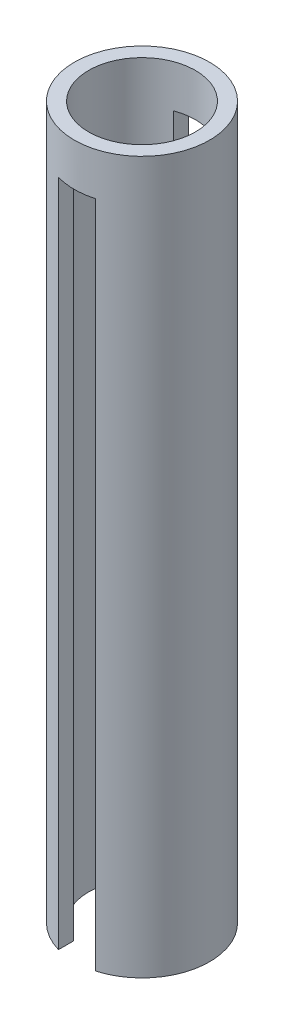
ISO-10303-21;
HEADER;
FILE_DESCRIPTION(('STEP AP214'),'2;1');
FILE_NAME('part.step','',(''),(''),'','','');
FILE_SCHEMA(('AUTOMOTIVE_DESIGN { 1 0 10303 214 1 1 1 1 }'));
ENDSEC;
DATA;
#1=APPLICATION_CONTEXT('core data for automotive mechanical design processes');
#2=APPLICATION_PROTOCOL_DEFINITION('international standard','automotive_design',2000,#1);
#3=PRODUCT_CONTEXT('',#1,'mechanical');
#4=PRODUCT('Part','Part','',(#3));
#5=PRODUCT_RELATED_PRODUCT_CATEGORY('part','',(#4));
#6=PRODUCT_DEFINITION_FORMATION('','',#4);
#7=PRODUCT_DEFINITION_CONTEXT('part definition',#1,'design');
#8=PRODUCT_DEFINITION('design','',#6,#7);
#9=PRODUCT_DEFINITION_SHAPE('','',#8);
#10=(LENGTH_UNIT() NAMED_UNIT(*) SI_UNIT(.MILLI.,.METRE.));
#11=(NAMED_UNIT(*) PLANE_ANGLE_UNIT() SI_UNIT($,.RADIAN.));
#12=(NAMED_UNIT(*) SI_UNIT($,.STERADIAN.) SOLID_ANGLE_UNIT());
#13=UNCERTAINTY_MEASURE_WITH_UNIT(LENGTH_MEASURE(1.E-05),#10,'distance_accuracy_value','');
#14=(GEOMETRIC_REPRESENTATION_CONTEXT(3) GLOBAL_UNCERTAINTY_ASSIGNED_CONTEXT((#13)) GLOBAL_UNIT_ASSIGNED_CONTEXT((#10,
#11,#12)) REPRESENTATION_CONTEXT('',''));
#15=CARTESIAN_POINT('',(0.,0.,0.));
#16=DIRECTION('',(0.,0.,1.));
#17=DIRECTION('',(1.,0.,0.));
#18=AXIS2_PLACEMENT_3D('',#15,#16,#17);
#19=CARTESIAN_POINT('',(0.,0.,0.));
#20=DIRECTION('',(0.,1.,0.));
#21=DIRECTION('',(0.,0.,1.));
#22=AXIS2_PLACEMENT_3D('',#19,#20,#21);
#23=PLANE('',#22);
#24=CARTESIAN_POINT('',(0.,0.,0.));
#25=DIRECTION('',(0.,1.,0.));
#26=DIRECTION('',(0.,0.,1.));
#27=AXIS2_PLACEMENT_3D('',#24,#25,#26);
#28=CIRCLE('',#27,9.5);
#29=CARTESIAN_POINT('',(-2.6,0.,-9.13728624920988));
#30=VERTEX_POINT('',#29);
#31=CARTESIAN_POINT('',(-2.6,0.,9.13728624920988));
#32=VERTEX_POINT('',#31);
#33=EDGE_CURVE('E122',#30,#32,#28,.T.);
#34=ORIENTED_EDGE('',*,*,#33,.F.);
#35=DIRECTION('',(0.,0.,1.));
#36=VECTOR('',#35,1.);
#37=CARTESIAN_POINT('',(-2.6,0.,-80.));
#38=LINE('',#37,#36);
#39=CARTESIAN_POINT('',(-2.6,0.,-7.03491293478463));
#40=VERTEX_POINT('',#39);
#41=EDGE_CURVE('E106',#30,#40,#38,.T.);
#42=ORIENTED_EDGE('',*,*,#41,.T.);
#43=CARTESIAN_POINT('',(0.,0.,0.));
#44=DIRECTION('',(0.,1.,0.));
#45=DIRECTION('',(0.,0.,1.));
#46=AXIS2_PLACEMENT_3D('',#43,#44,#45);
#47=CIRCLE('',#46,7.5);
#48=CARTESIAN_POINT('',(-2.6,0.,7.03491293478463));
#49=VERTEX_POINT('',#48);
#50=EDGE_CURVE('E147',#40,#49,#47,.T.);
#51=ORIENTED_EDGE('',*,*,#50,.T.);
#52=EDGE_CURVE('E165',#49,#32,#38,.T.);
#53=ORIENTED_EDGE('',*,*,#52,.T.);
#54=EDGE_LOOP('',(#34,#42,#51,#53));
#55=FACE_BOUND('',#54,.T.);
#56=ADVANCED_FACE('F35',(#55),#23,.F.);
#57=CARTESIAN_POINT('',(0.,100.,0.));
#58=DIRECTION('',(0.,1.,0.));
#59=DIRECTION('',(0.,0.,1.));
#60=AXIS2_PLACEMENT_3D('',#57,#58,#59);
#61=PLANE('',#60);
#62=CARTESIAN_POINT('',(0.,100.,0.));
#63=DIRECTION('',(0.,1.,0.));
#64=DIRECTION('',(0.,0.,1.));
#65=AXIS2_PLACEMENT_3D('',#62,#63,#64);
#66=CIRCLE('',#65,9.5);
#67=CARTESIAN_POINT('',(0.,100.,9.5));
#68=VERTEX_POINT('',#67);
#69=EDGE_CURVE('E121',#68,#68,#66,.T.);
#70=ORIENTED_EDGE('',*,*,#69,.T.);
#71=EDGE_LOOP('',(#70));
#72=FACE_BOUND('',#71,.T.);
#73=CARTESIAN_POINT('',(0.,100.,0.));
#74=DIRECTION('',(0.,1.,0.));
#75=DIRECTION('',(0.,0.,1.));
#76=AXIS2_PLACEMENT_3D('',#73,#74,#75);
#77=CIRCLE('',#76,7.5);
#78=CARTESIAN_POINT('',(0.,100.,7.5));
#79=VERTEX_POINT('',#78);
#80=EDGE_CURVE('E127',#79,#79,#77,.T.);
#81=ORIENTED_EDGE('',*,*,#80,.F.);
#82=EDGE_LOOP('',(#81));
#83=FACE_BOUND('',#82,.T.);
#84=ADVANCED_FACE('F190',(#72,#83),#61,.T.);
#85=CARTESIAN_POINT('',(2.6,0.,9.13728624920988));
#86=VERTEX_POINT('',#85);
#87=CARTESIAN_POINT('',(2.6,0.,-9.13728624920988));
#88=VERTEX_POINT('',#87);
#89=EDGE_CURVE('E113',#86,#88,#28,.T.);
#90=ORIENTED_EDGE('',*,*,#89,.F.);
#91=DIRECTION('',(0.,0.,1.));
#92=VECTOR('',#91,1.);
#93=CARTESIAN_POINT('',(2.6,0.,-80.));
#94=LINE('',#93,#92);
#95=CARTESIAN_POINT('',(2.6,0.,7.03491293478463));
#96=VERTEX_POINT('',#95);
#97=EDGE_CURVE('E116',#96,#86,#94,.T.);
#98=ORIENTED_EDGE('',*,*,#97,.F.);
#99=CARTESIAN_POINT('',(2.6,0.,-7.03491293478462));
#100=VERTEX_POINT('',#99);
#101=EDGE_CURVE('E115',#96,#100,#47,.T.);
#102=ORIENTED_EDGE('',*,*,#101,.T.);
#103=EDGE_CURVE('E58',#88,#100,#94,.T.);
#104=ORIENTED_EDGE('',*,*,#103,.F.);
#105=EDGE_LOOP('',(#90,#98,#102,#104));
#106=FACE_BOUND('',#105,.T.);
#107=ADVANCED_FACE('F111',(#106),#23,.F.);
#108=CARTESIAN_POINT('',(0.,100.,0.));
#109=DIRECTION('',(0.,-1.,0.));
#110=DIRECTION('',(0.,0.,-1.));
#111=AXIS2_PLACEMENT_3D('',#108,#109,#110);
#112=CYLINDRICAL_SURFACE('',#111,9.5);
#113=ORIENTED_EDGE('',*,*,#69,.F.);
#114=EDGE_LOOP('',(#113));
#115=FACE_BOUND('',#114,.T.);
#116=ORIENTED_EDGE('',*,*,#33,.T.);
#117=DIRECTION('',(0.,-1.,0.));
#118=VECTOR('',#117,1.);
#119=CARTESIAN_POINT('',(-2.6,100.,9.13728624920988));
#120=LINE('',#119,#118);
#121=CARTESIAN_POINT('',(-2.6,94.,9.13728624920988));
#122=VERTEX_POINT('',#121);
#123=EDGE_CURVE('E155',#32,#122,#120,.F.);
#124=ORIENTED_EDGE('',*,*,#123,.T.);
#125=CARTESIAN_POINT('',(0.,94.,0.));
#126=DIRECTION('',(0.,1.,0.));
#127=DIRECTION('',(0.,0.,1.));
#128=AXIS2_PLACEMENT_3D('',#125,#126,#127);
#129=CIRCLE('',#128,9.5);
#130=CARTESIAN_POINT('',(2.6,94.,9.13728624920988));
#131=VERTEX_POINT('',#130);
#132=EDGE_CURVE('E159',#122,#131,#129,.T.);
#133=ORIENTED_EDGE('',*,*,#132,.T.);
#134=DIRECTION('',(0.,-1.,0.));
#135=VECTOR('',#134,1.);
#136=CARTESIAN_POINT('',(2.6,100.,9.13728624920988));
#137=LINE('',#136,#135);
#138=EDGE_CURVE('E105',#131,#86,#137,.T.);
#139=ORIENTED_EDGE('',*,*,#138,.T.);
#140=ORIENTED_EDGE('',*,*,#89,.T.);
#141=DIRECTION('',(0.,-1.,0.));
#142=VECTOR('',#141,1.);
#143=CARTESIAN_POINT('',(2.6,100.,-9.13728624920988));
#144=LINE('',#143,#142);
#145=CARTESIAN_POINT('',(2.6,94.,-9.13728624920988));
#146=VERTEX_POINT('',#145);
#147=EDGE_CURVE('E98',#88,#146,#144,.F.);
#148=ORIENTED_EDGE('',*,*,#147,.T.);
#149=CARTESIAN_POINT('',(-2.6,94.,-9.13728624920988));
#150=VERTEX_POINT('',#149);
#151=EDGE_CURVE('E158',#146,#150,#129,.T.);
#152=ORIENTED_EDGE('',*,*,#151,.T.);
#153=DIRECTION('',(0.,-1.,0.));
#154=VECTOR('',#153,1.);
#155=CARTESIAN_POINT('',(-2.6,100.,-9.13728624920988));
#156=LINE('',#155,#154);
#157=EDGE_CURVE('E151',#150,#30,#156,.T.);
#158=ORIENTED_EDGE('',*,*,#157,.T.);
#159=EDGE_LOOP('',(#116,#124,#133,#139,#140,#148,#152,#158));
#160=FACE_BOUND('',#159,.T.);
#161=ADVANCED_FACE('F37',(#115,#160),#112,.T.);
#162=CARTESIAN_POINT('',(0.,100.,0.));
#163=DIRECTION('',(0.,-1.,0.));
#164=DIRECTION('',(0.,0.,-1.));
#165=AXIS2_PLACEMENT_3D('',#162,#163,#164);
#166=CYLINDRICAL_SURFACE('',#165,7.5);
#167=DIRECTION('',(0.,-1.,0.));
#168=VECTOR('',#167,1.);
#169=CARTESIAN_POINT('',(-2.6,100.,7.03491293478462));
#170=LINE('',#169,#168);
#171=CARTESIAN_POINT('',(-2.6,94.,7.03491293478462));
#172=VERTEX_POINT('',#171);
#173=EDGE_CURVE('E11',#49,#172,#170,.F.);
#174=ORIENTED_EDGE('',*,*,#173,.F.);
#175=ORIENTED_EDGE('',*,*,#50,.F.);
#176=DIRECTION('',(0.,-1.,0.));
#177=VECTOR('',#176,1.);
#178=CARTESIAN_POINT('',(-2.6,100.,-7.03491293478462));
#179=LINE('',#178,#177);
#180=CARTESIAN_POINT('',(-2.6,94.,-7.03491293478462));
#181=VERTEX_POINT('',#180);
#182=EDGE_CURVE('E133',#181,#40,#179,.T.);
#183=ORIENTED_EDGE('',*,*,#182,.F.);
#184=CARTESIAN_POINT('',(0.,94.,0.));
#185=DIRECTION('',(0.,1.,0.));
#186=DIRECTION('',(0.,0.,1.));
#187=AXIS2_PLACEMENT_3D('',#184,#185,#186);
#188=CIRCLE('',#187,7.5);
#189=CARTESIAN_POINT('',(2.6,94.,-7.03491293478463));
#190=VERTEX_POINT('',#189);
#191=EDGE_CURVE('E131',#190,#181,#188,.T.);
#192=ORIENTED_EDGE('',*,*,#191,.F.);
#193=DIRECTION('',(0.,-1.,0.));
#194=VECTOR('',#193,1.);
#195=CARTESIAN_POINT('',(2.6,100.,-7.03491293478462));
#196=LINE('',#195,#194);
#197=EDGE_CURVE('E125',#100,#190,#196,.F.);
#198=ORIENTED_EDGE('',*,*,#197,.F.);
#199=ORIENTED_EDGE('',*,*,#101,.F.);
#200=DIRECTION('',(0.,-1.,0.));
#201=VECTOR('',#200,1.);
#202=CARTESIAN_POINT('',(2.6,100.,7.03491293478462));
#203=LINE('',#202,#201);
#204=CARTESIAN_POINT('',(2.6,94.,7.03491293478462));
#205=VERTEX_POINT('',#204);
#206=EDGE_CURVE('E134',#205,#96,#203,.T.);
#207=ORIENTED_EDGE('',*,*,#206,.F.);
#208=EDGE_CURVE('E43',#172,#205,#188,.T.);
#209=ORIENTED_EDGE('',*,*,#208,.F.);
#210=EDGE_LOOP('',(#174,#175,#183,#192,#198,#199,#207,#209));
#211=FACE_BOUND('',#210,.T.);
#212=ORIENTED_EDGE('',*,*,#80,.T.);
#213=EDGE_LOOP('',(#212));
#214=FACE_BOUND('',#213,.T.);
#215=ADVANCED_FACE('F144',(#211,#214),#166,.F.);
#216=CARTESIAN_POINT('',(2.6,0.,-80.));
#217=DIRECTION('',(1.,0.,0.));
#218=DIRECTION('',(0.,0.,-1.));
#219=AXIS2_PLACEMENT_3D('',#216,#217,#218);
#220=PLANE('',#219);
#221=ORIENTED_EDGE('',*,*,#103,.T.);
#222=ORIENTED_EDGE('',*,*,#197,.T.);
#223=DIRECTION('',(0.,0.,1.));
#224=VECTOR('',#223,1.);
#225=CARTESIAN_POINT('',(2.6,94.,-80.));
#226=LINE('',#225,#224);
#227=EDGE_CURVE('E101',#146,#190,#226,.T.);
#228=ORIENTED_EDGE('',*,*,#227,.F.);
#229=ORIENTED_EDGE('',*,*,#147,.F.);
#230=EDGE_LOOP('',(#221,#222,#228,#229));
#231=FACE_BOUND('',#230,.T.);
#232=ADVANCED_FACE('F99',(#231),#220,.F.);
#233=CARTESIAN_POINT('',(-2.6,94.,-80.));
#234=DIRECTION('',(0.,1.,0.));
#235=DIRECTION('',(0.,0.,1.));
#236=AXIS2_PLACEMENT_3D('',#233,#234,#235);
#237=PLANE('',#236);
#238=ORIENTED_EDGE('',*,*,#227,.T.);
#239=ORIENTED_EDGE('',*,*,#191,.T.);
#240=DIRECTION('',(0.,0.,1.));
#241=VECTOR('',#240,1.);
#242=CARTESIAN_POINT('',(-2.6,94.,-80.));
#243=LINE('',#242,#241);
#244=EDGE_CURVE('E164',#150,#181,#243,.T.);
#245=ORIENTED_EDGE('',*,*,#244,.F.);
#246=ORIENTED_EDGE('',*,*,#151,.F.);
#247=EDGE_LOOP('',(#238,#239,#245,#246));
#248=FACE_BOUND('',#247,.T.);
#249=ADVANCED_FACE('F177',(#248),#237,.F.);
#250=CARTESIAN_POINT('',(-2.6,0.,-80.));
#251=DIRECTION('',(-1.,0.,0.));
#252=DIRECTION('',(0.,0.,1.));
#253=AXIS2_PLACEMENT_3D('',#250,#251,#252);
#254=PLANE('',#253);
#255=ORIENTED_EDGE('',*,*,#244,.T.);
#256=ORIENTED_EDGE('',*,*,#182,.T.);
#257=ORIENTED_EDGE('',*,*,#41,.F.);
#258=ORIENTED_EDGE('',*,*,#157,.F.);
#259=EDGE_LOOP('',(#255,#256,#257,#258));
#260=FACE_BOUND('',#259,.T.);
#261=ADVANCED_FACE('F174',(#260),#254,.F.);
#262=ORIENTED_EDGE('',*,*,#52,.F.);
#263=ORIENTED_EDGE('',*,*,#173,.T.);
#264=EDGE_CURVE('E141',#172,#122,#243,.T.);
#265=ORIENTED_EDGE('',*,*,#264,.T.);
#266=ORIENTED_EDGE('',*,*,#123,.F.);
#267=EDGE_LOOP('',(#262,#263,#265,#266));
#268=FACE_BOUND('',#267,.T.);
#269=ADVANCED_FACE('F184',(#268),#254,.F.);
#270=ORIENTED_EDGE('',*,*,#264,.F.);
#271=ORIENTED_EDGE('',*,*,#208,.T.);
#272=EDGE_CURVE('E50',#205,#131,#226,.T.);
#273=ORIENTED_EDGE('',*,*,#272,.T.);
#274=ORIENTED_EDGE('',*,*,#132,.F.);
#275=EDGE_LOOP('',(#270,#271,#273,#274));
#276=FACE_BOUND('',#275,.T.);
#277=ADVANCED_FACE('F139',(#276),#237,.F.);
#278=ORIENTED_EDGE('',*,*,#272,.F.);
#279=ORIENTED_EDGE('',*,*,#206,.T.);
#280=ORIENTED_EDGE('',*,*,#97,.T.);
#281=ORIENTED_EDGE('',*,*,#138,.F.);
#282=EDGE_LOOP('',(#278,#279,#280,#281));
#283=FACE_BOUND('',#282,.T.);
#284=ADVANCED_FACE('F187',(#283),#220,.F.);
#285=CLOSED_SHELL('',(#56,#84,#107,#161,#215,#232,#249,#261,#269,#277,#284));
#286=MANIFOLD_SOLID_BREP('B2',#285);
#287=ADVANCED_BREP_SHAPE_REPRESENTATION('',(#18,#286),#14);
#288=SHAPE_DEFINITION_REPRESENTATION(#9,#287);
ENDSEC;
END-ISO-10303-21;
